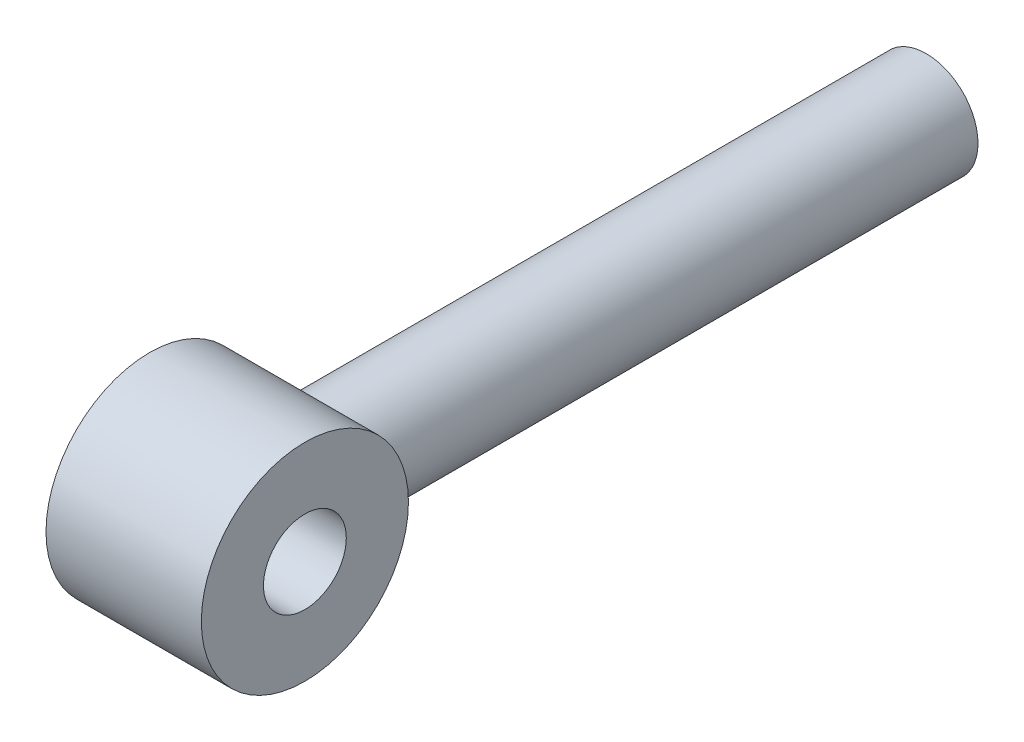
ISO-10303-21;
HEADER;
FILE_DESCRIPTION(('STEP AP214'),'2;1');
FILE_NAME('part.step','',(''),(''),'','','');
FILE_SCHEMA(('AUTOMOTIVE_DESIGN { 1 0 10303 214 1 1 1 1 }'));
ENDSEC;
DATA;
#1=APPLICATION_CONTEXT('core data for automotive mechanical design processes');
#2=APPLICATION_PROTOCOL_DEFINITION('international standard','automotive_design',2000,#1);
#3=PRODUCT_CONTEXT('',#1,'mechanical');
#4=PRODUCT('Part','Part','',(#3));
#5=PRODUCT_RELATED_PRODUCT_CATEGORY('part','',(#4));
#6=PRODUCT_DEFINITION_FORMATION('','',#4);
#7=PRODUCT_DEFINITION_CONTEXT('part definition',#1,'design');
#8=PRODUCT_DEFINITION('design','',#6,#7);
#9=PRODUCT_DEFINITION_SHAPE('','',#8);
#10=(LENGTH_UNIT() NAMED_UNIT(*) SI_UNIT(.MILLI.,.METRE.));
#11=(NAMED_UNIT(*) PLANE_ANGLE_UNIT() SI_UNIT($,.RADIAN.));
#12=(NAMED_UNIT(*) SI_UNIT($,.STERADIAN.) SOLID_ANGLE_UNIT());
#13=UNCERTAINTY_MEASURE_WITH_UNIT(LENGTH_MEASURE(1.E-05),#10,'distance_accuracy_value','');
#14=(GEOMETRIC_REPRESENTATION_CONTEXT(3) GLOBAL_UNCERTAINTY_ASSIGNED_CONTEXT((#13)) GLOBAL_UNIT_ASSIGNED_CONTEXT((#10,
#11,#12)) REPRESENTATION_CONTEXT('',''));
#15=CARTESIAN_POINT('',(0.,0.,0.));
#16=DIRECTION('',(0.,0.,1.));
#17=DIRECTION('',(1.,0.,0.));
#18=AXIS2_PLACEMENT_3D('',#15,#16,#17);
#19=CARTESIAN_POINT('',(0.,0.,-3.));
#20=DIRECTION('',(0.,0.,-1.));
#21=DIRECTION('',(-1.,0.,0.));
#22=AXIS2_PLACEMENT_3D('',#19,#20,#21);
#23=CYLINDRICAL_SURFACE('',#22,2.);
#24=CARTESIAN_POINT('',(0.,0.,-27.));
#25=DIRECTION('',(0.,0.,1.));
#26=DIRECTION('',(1.,0.,0.));
#27=AXIS2_PLACEMENT_3D('',#24,#25,#26);
#28=CIRCLE('',#27,2.);
#29=CARTESIAN_POINT('',(2.,0.,-27.));
#30=VERTEX_POINT('',#29);
#31=EDGE_CURVE('E49',#30,#30,#28,.T.);
#32=ORIENTED_EDGE('',*,*,#31,.T.);
#33=EDGE_LOOP('',(#32));
#34=FACE_BOUND('',#33,.T.);
#35=CARTESIAN_POINT('',(-2.,0.,-4.));
#36=CARTESIAN_POINT('',(-1.99999339536562,-0.105143925902467,-3.99999426810082));
#37=CARTESIAN_POINT('',(-1.99165985375789,-0.210413199395125,-3.99580982039513));
#38=CARTESIAN_POINT('',(-1.95869423931692,-0.417840470537792,-3.97948312074314));
#39=CARTESIAN_POINT('',(-1.93403121400437,-0.519992173427259,-3.96732575657839));
#40=CARTESIAN_POINT('',(-1.86961238276674,-0.717867089760898,-3.93632558806751));
#41=CARTESIAN_POINT('',(-1.82991523150406,-0.813613605878292,-3.91750878355075));
#42=CARTESIAN_POINT('',(-1.73685875727003,-0.996945233613197,-3.87491553031523));
#43=CARTESIAN_POINT('',(-1.68350051150227,-1.08453098798012,-3.8511394726705));
#44=CARTESIAN_POINT('',(-1.56096550102943,-1.25501563552382,-3.79912516516124));
#45=CARTESIAN_POINT('',(-1.49102704152072,-1.33731042224422,-3.77070398255074));
#46=CARTESIAN_POINT('',(-1.33895704150593,-1.48955888973396,-3.71319940493486));
#47=CARTESIAN_POINT('',(-1.25681629645512,-1.55950316621353,-3.68411552418069));
#48=CARTESIAN_POINT('',(-1.07503330095324,-1.69050400090056,-3.62597902394695));
#49=CARTESIAN_POINT('',(-0.974527803308175,-1.75045067110327,-3.59710373940264));
#50=CARTESIAN_POINT('',(-0.763265328027571,-1.85233645378139,-3.54571957544641));
#51=CARTESIAN_POINT('',(-0.652515742554502,-1.89428842993267,-3.52320615213979));
#52=CARTESIAN_POINT('',(-0.430669789156156,-1.95626488437718,-3.48915734075617));
#53=CARTESIAN_POINT('',(-0.319991095865213,-1.97745171416088,-3.47704543167427));
#54=CARTESIAN_POINT('',(-0.0960423244410471,-2.00085398661769,-3.46363779897055));
#55=CARTESIAN_POINT('',(0.0172250817423089,-2.00308817674615,-3.46233138686576));
#56=CARTESIAN_POINT('',(0.228572048630736,-1.98937457434459,-3.47021860514497));
#57=CARTESIAN_POINT('',(0.3268480624461,-1.97556911907364,-3.47817527324027));
#58=CARTESIAN_POINT('',(0.519443818746084,-1.93387969811386,-3.50152457467701));
#59=CARTESIAN_POINT('',(0.613762290610631,-1.9059912477953,-3.51691957663553));
#60=CARTESIAN_POINT('',(0.798458265131318,-1.83641956077201,-3.55374952825482));
#61=CARTESIAN_POINT('',(0.888692797571577,-1.79443013423199,-3.57531681327997));
#62=CARTESIAN_POINT('',(1.06126858518002,-1.698083375336,-3.62206808562807));
#63=CARTESIAN_POINT('',(1.14360627120018,-1.64372048762494,-3.64725369560381));
#64=CARTESIAN_POINT('',(1.30904250548645,-1.51613210982558,-3.70226315806571));
#65=CARTESIAN_POINT('',(1.39091374715231,-1.44138891673856,-3.73227020473492));
#66=CARTESIAN_POINT('',(1.5414708371818,-1.27911115748275,-3.79095246600814));
#67=CARTESIAN_POINT('',(1.61015038406777,-1.19157051314857,-3.81962703917602));
#68=CARTESIAN_POINT('',(1.73537132205945,-1.0010330116637,-3.87403974565928));
#69=CARTESIAN_POINT('',(1.79120094489148,-0.897507183198818,-3.89957968324014));
#70=CARTESIAN_POINT('',(1.88419405808602,-0.680932430977594,-3.94315762242485));
#71=CARTESIAN_POINT('',(1.92137237003033,-0.567891152530552,-3.96120157887106));
#72=CARTESIAN_POINT('',(1.97295080743335,-0.345532983321405,-3.98648667482871));
#73=CARTESIAN_POINT('',(1.98898247149356,-0.236683061096653,-3.9944987660262));
#74=CARTESIAN_POINT('',(2.00292946226897,-0.0175591998987038,-4.00146026918207));
#75=CARTESIAN_POINT('',(2.00085337127894,0.0927140397398168,-4.00041397442637));
#76=CARTESIAN_POINT('',(1.97958662316251,0.302465943971973,-3.9898238450687));
#77=CARTESIAN_POINT('',(1.96173493454001,0.40211881609986,-3.98094491376337));
#78=CARTESIAN_POINT('',(1.91152385620976,0.596813784603882,-3.95644342629681));
#79=CARTESIAN_POINT('',(1.87916286709301,0.691855371382173,-3.94082012668824));
#80=CARTESIAN_POINT('',(1.80000306713393,0.877777216899145,-3.90368502827176));
#81=CARTESIAN_POINT('',(1.75281789976743,0.968460794011606,-3.88201763539261));
#82=CARTESIAN_POINT('',(1.64578492870687,1.14092272339854,-3.83487948634835));
#83=CARTESIAN_POINT('',(1.58593173080921,1.22269725955318,-3.80940711133877));
#84=CARTESIAN_POINT('',(1.44847914933857,1.38353537857843,-3.75416442672396));
#85=CARTESIAN_POINT('',(1.36971426310971,1.46154415563805,-3.72421769686998));
#86=CARTESIAN_POINT('',(1.20014969744454,1.60371264223771,-3.6652478321764));
#87=CARTESIAN_POINT('',(1.10934176230416,1.66786277142375,-3.63622534800094));
#88=CARTESIAN_POINT('',(0.912712691654049,1.78341582895804,-3.58102384412979));
#89=CARTESIAN_POINT('',(0.806377467811037,1.8340509916005,-3.55505059178121));
#90=CARTESIAN_POINT('',(0.584979864850068,1.91616565186941,-3.51148144588269));
#91=CARTESIAN_POINT('',(0.46992894706622,1.94766983173403,-3.493874764435));
#92=CARTESIAN_POINT('',(0.246179554230592,1.98772337493374,-3.47123002051604));
#93=CARTESIAN_POINT('',(0.137931493129517,1.9981859928109,-3.4651476693013));
#94=CARTESIAN_POINT('',(-0.0788941343290491,2.0013783087524,-3.46330709283206));
#95=CARTESIAN_POINT('',(-0.187471537475722,1.99411569324648,-3.4675443925278));
#96=CARTESIAN_POINT('',(-0.390967003066873,1.96385225118662,-3.48475724102153));
#97=CARTESIAN_POINT('',(-0.486200940289478,1.94241662868607,-3.49686188965317));
#98=CARTESIAN_POINT('',(-0.671616238848733,1.88635071644882,-3.52742032375305));
#99=CARTESIAN_POINT('',(-0.761795964184063,1.85171618231984,-3.54587615139337));
#100=CARTESIAN_POINT('',(-0.941249701973073,1.76763149060113,-3.58857060729071));
#101=CARTESIAN_POINT('',(-1.03005580365806,1.7173422756314,-3.61311444791841));
#102=CARTESIAN_POINT('',(-1.19854907236252,1.60430194327478,-3.66470663269721));
#103=CARTESIAN_POINT('',(-1.27823146104222,1.54154434248312,-3.69175627591221));
#104=CARTESIAN_POINT('',(-1.43628396470935,1.39640665332275,-3.74924646316184));
#105=CARTESIAN_POINT('',(-1.51331820470058,1.31256884599452,-3.77969966613256));
#106=CARTESIAN_POINT('',(-1.65252596687054,1.1323096124664,-3.83755504519861));
#107=CARTESIAN_POINT('',(-1.71469147893981,1.03588144661039,-3.8649555725239));
#108=CARTESIAN_POINT('',(-1.82247272542414,0.831863193565892,-3.91396019133075));
#109=CARTESIAN_POINT('',(-1.86796833847294,0.724199007553462,-3.93552192987866));
#110=CARTESIAN_POINT('',(-1.93961633551482,0.501484202276174,-3.97002682597974));
#111=CARTESIAN_POINT('',(-1.96582369361143,0.386455599178201,-3.98299446726136));
#112=CARTESIAN_POINT('',(-1.98779482217148,0.225203892981791,-3.99390923826956));
#113=CARTESIAN_POINT('',(-1.99236528173268,0.18032375888313,-3.99618730680502));
#114=CARTESIAN_POINT('',(-1.99846933102817,0.0903034636101833,-3.99923393953631));
#115=CARTESIAN_POINT('',(-2.00000283694042,0.0451632952932569,-4.00000246206762));
#116=CARTESIAN_POINT('',(-2.,0.,-4.));
#117=B_SPLINE_CURVE_WITH_KNOTS('',3,(#35,#36,#37,#38,#39,#40,#41,#42,#43,#44,#45,#46,#47,#48,
#49,#50,#51,#52,#53,#54,#55,#56,#57,#58,#59,#60,#61,#62,#63,#64,#65,#66,#67,#68,#69,#70,#71,#72,
#73,#74,#75,#76,#77,#78,#79,#80,#81,#82,#83,#84,#85,#86,#87,#88,#89,#90,#91,#92,#93,#94,#95,#96,
#97,#98,#99,#100,#101,#102,#103,#104,#105,#106,#107,#108,#109,#110,#111,#112,#113,#114,#115,
#116),.UNSPECIFIED.,.T.,.F.,(4,2,2,2,2,2,2,2,2,2,2,2,2,2,2,2,2,2,2,2,2,2,2,2,2,2,2,2,2,2,2,2,2,
2,2,2,2,2,2,2,4),(0.,0.315248514840585,0.631096299418395,0.945724310984597,1.26032752116314,
1.59396351743618,1.92785247530807,2.28763452861505,2.64715895796562,2.98516024280459,
3.32282714658041,3.62011424818641,3.91749607851357,4.22180480336975,4.52625042520444,
4.86929882667757,5.21251069197373,5.57166044428881,5.93052433824559,6.25966580942691,
6.58865129022952,6.89213813012244,7.19565843261863,7.50785712055797,7.82018901496678,
8.16319221288838,8.50643177230864,8.86629364323452,9.22569023890901,9.55058615006093,
9.87534119729357,10.1691586049771,10.463070575767,10.7767291356057,11.0905512228726,
11.4425048551434,11.7946476676249,12.1492802732705,12.502898172423,12.6383056026783,
12.7737167702213),.UNSPECIFIED.);
#118=CARTESIAN_POINT('',(-2.,0.,-4.));
#119=VERTEX_POINT('',#118);
#120=EDGE_CURVE('E10',#119,#119,#117,.T.);
#121=ORIENTED_EDGE('',*,*,#120,.F.);
#122=EDGE_LOOP('',(#121));
#123=FACE_BOUND('',#122,.T.);
#124=ADVANCED_FACE('F41',(#34,#123),#23,.T.);
#125=CARTESIAN_POINT('',(0.,0.,-27.));
#126=DIRECTION('',(0.,0.,1.));
#127=DIRECTION('',(1.,0.,0.));
#128=AXIS2_PLACEMENT_3D('',#125,#126,#127);
#129=PLANE('',#128);
#130=ORIENTED_EDGE('',*,*,#31,.F.);
#131=EDGE_LOOP('',(#130));
#132=FACE_BOUND('',#131,.T.);
#133=ADVANCED_FACE('F65',(#132),#129,.F.);
#134=CARTESIAN_POINT('',(3.,0.,0.));
#135=DIRECTION('',(-1.,0.,0.));
#136=DIRECTION('',(0.,0.,1.));
#137=AXIS2_PLACEMENT_3D('',#134,#135,#136);
#138=CYLINDRICAL_SURFACE('',#137,4.);
#139=CARTESIAN_POINT('',(-3.,0.,0.));
#140=DIRECTION('',(1.,0.,0.));
#141=DIRECTION('',(0.,0.,-1.));
#142=AXIS2_PLACEMENT_3D('',#139,#140,#141);
#143=CIRCLE('',#142,4.);
#144=CARTESIAN_POINT('',(-3.,0.,-4.));
#145=VERTEX_POINT('',#144);
#146=EDGE_CURVE('E145',#145,#145,#143,.T.);
#147=ORIENTED_EDGE('',*,*,#146,.T.);
#148=EDGE_LOOP('',(#147));
#149=FACE_BOUND('',#148,.T.);
#150=CARTESIAN_POINT('',(3.,0.,0.));
#151=DIRECTION('',(1.,0.,0.));
#152=DIRECTION('',(0.,0.,-1.));
#153=AXIS2_PLACEMENT_3D('',#150,#151,#152);
#154=CIRCLE('',#153,4.);
#155=CARTESIAN_POINT('',(3.,0.,-4.));
#156=VERTEX_POINT('',#155);
#157=EDGE_CURVE('E53',#156,#156,#154,.T.);
#158=ORIENTED_EDGE('',*,*,#157,.F.);
#159=EDGE_LOOP('',(#158));
#160=FACE_BOUND('',#159,.T.);
#161=ORIENTED_EDGE('',*,*,#120,.T.);
#162=EDGE_LOOP('',(#161));
#163=FACE_BOUND('',#162,.T.);
#164=ADVANCED_FACE('F60',(#149,#160,#163),#138,.T.);
#165=CARTESIAN_POINT('',(3.,0.,0.));
#166=DIRECTION('',(1.,0.,0.));
#167=DIRECTION('',(0.,0.,-1.));
#168=AXIS2_PLACEMENT_3D('',#165,#166,#167);
#169=PLANE('',#168);
#170=CARTESIAN_POINT('',(3.,0.,0.));
#171=DIRECTION('',(1.,0.,0.));
#172=DIRECTION('',(0.,0.,-1.));
#173=AXIS2_PLACEMENT_3D('',#170,#171,#172);
#174=CIRCLE('',#173,1.6);
#175=CARTESIAN_POINT('',(3.,0.,-1.6));
#176=VERTEX_POINT('',#175);
#177=EDGE_CURVE('E141',#176,#176,#174,.F.);
#178=ORIENTED_EDGE('',*,*,#177,.T.);
#179=EDGE_LOOP('',(#178));
#180=FACE_BOUND('',#179,.T.);
#181=ORIENTED_EDGE('',*,*,#157,.T.);
#182=EDGE_LOOP('',(#181));
#183=FACE_BOUND('',#182,.T.);
#184=ADVANCED_FACE('F64',(#180,#183),#169,.T.);
#185=CARTESIAN_POINT('',(-3.,0.,0.));
#186=DIRECTION('',(1.,0.,0.));
#187=DIRECTION('',(0.,0.,-1.));
#188=AXIS2_PLACEMENT_3D('',#185,#186,#187);
#189=PLANE('',#188);
#190=CARTESIAN_POINT('',(-3.,0.,0.));
#191=DIRECTION('',(1.,0.,0.));
#192=DIRECTION('',(0.,0.,-1.));
#193=AXIS2_PLACEMENT_3D('',#190,#191,#192);
#194=CIRCLE('',#193,1.6);
#195=CARTESIAN_POINT('',(-3.,0.,-1.6));
#196=VERTEX_POINT('',#195);
#197=EDGE_CURVE('E45',#196,#196,#194,.F.);
#198=ORIENTED_EDGE('',*,*,#197,.F.);
#199=EDGE_LOOP('',(#198));
#200=FACE_BOUND('',#199,.T.);
#201=ORIENTED_EDGE('',*,*,#146,.F.);
#202=EDGE_LOOP('',(#201));
#203=FACE_BOUND('',#202,.T.);
#204=ADVANCED_FACE('F67',(#200,#203),#189,.F.);
#205=CARTESIAN_POINT('',(4.,0.,0.));
#206=DIRECTION('',(-1.,0.,0.));
#207=DIRECTION('',(0.,0.,1.));
#208=AXIS2_PLACEMENT_3D('',#205,#206,#207);
#209=CYLINDRICAL_SURFACE('',#208,1.6);
#210=ORIENTED_EDGE('',*,*,#177,.F.);
#211=EDGE_LOOP('',(#210));
#212=FACE_BOUND('',#211,.T.);
#213=ORIENTED_EDGE('',*,*,#197,.T.);
#214=EDGE_LOOP('',(#213));
#215=FACE_BOUND('',#214,.T.);
#216=ADVANCED_FACE('F105',(#212,#215),#209,.F.);
#217=CLOSED_SHELL('',(#124,#133,#164,#184,#204,#216));
#218=MANIFOLD_SOLID_BREP('B2',#217);
#219=ADVANCED_BREP_SHAPE_REPRESENTATION('',(#18,#218),#14);
#220=SHAPE_DEFINITION_REPRESENTATION(#9,#219);
ENDSEC;
END-ISO-10303-21;
